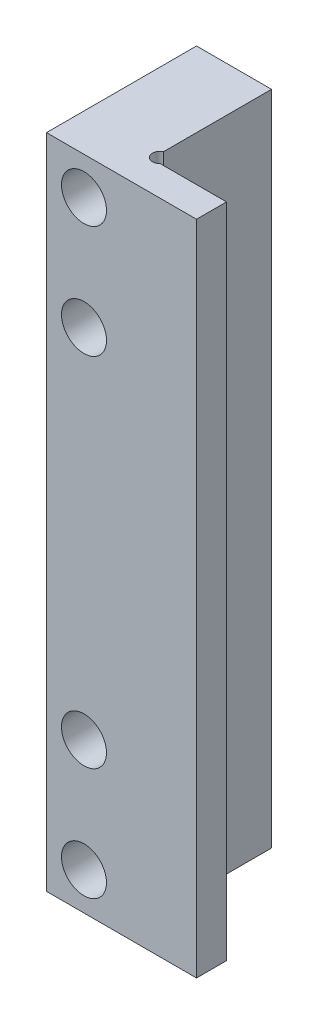
ISO-10303-21;
HEADER;
FILE_DESCRIPTION(('STEP AP214'),'2;1');
FILE_NAME('part.step','',(''),(''),'','','');
FILE_SCHEMA(('AUTOMOTIVE_DESIGN { 1 0 10303 214 1 1 1 1 }'));
ENDSEC;
DATA;
#1=APPLICATION_CONTEXT('core data for automotive mechanical design processes');
#2=APPLICATION_PROTOCOL_DEFINITION('international standard','automotive_design',2000,#1);
#3=PRODUCT_CONTEXT('',#1,'mechanical');
#4=PRODUCT('Part','Part','',(#3));
#5=PRODUCT_RELATED_PRODUCT_CATEGORY('part','',(#4));
#6=PRODUCT_DEFINITION_FORMATION('','',#4);
#7=PRODUCT_DEFINITION_CONTEXT('part definition',#1,'design');
#8=PRODUCT_DEFINITION('design','',#6,#7);
#9=PRODUCT_DEFINITION_SHAPE('','',#8);
#10=(LENGTH_UNIT() NAMED_UNIT(*) SI_UNIT(.MILLI.,.METRE.));
#11=(NAMED_UNIT(*) PLANE_ANGLE_UNIT() SI_UNIT($,.RADIAN.));
#12=(NAMED_UNIT(*) SI_UNIT($,.STERADIAN.) SOLID_ANGLE_UNIT());
#13=UNCERTAINTY_MEASURE_WITH_UNIT(LENGTH_MEASURE(1.E-05),#10,'distance_accuracy_value','');
#14=(GEOMETRIC_REPRESENTATION_CONTEXT(3) GLOBAL_UNCERTAINTY_ASSIGNED_CONTEXT((#13)) GLOBAL_UNIT_ASSIGNED_CONTEXT((#10,
#11,#12)) REPRESENTATION_CONTEXT('',''));
#15=CARTESIAN_POINT('',(0.,0.,0.));
#16=DIRECTION('',(0.,0.,1.));
#17=DIRECTION('',(1.,0.,0.));
#18=AXIS2_PLACEMENT_3D('',#15,#16,#17);
#19=CARTESIAN_POINT('',(-34.9,21.9,-10.));
#20=DIRECTION('',(-1.,0.,0.));
#21=DIRECTION('',(0.,0.,1.));
#22=AXIS2_PLACEMENT_3D('',#19,#20,#21);
#23=PLANE('',#22);
#24=DIRECTION('',(0.,-1.,0.));
#25=VECTOR('',#24,1.);
#26=CARTESIAN_POINT('',(-34.9,21.9,0.));
#27=LINE('',#26,#25);
#28=CARTESIAN_POINT('',(-34.9,21.9,0.));
#29=VERTEX_POINT('',#28);
#30=CARTESIAN_POINT('',(-34.9,-21.9,0.));
#31=VERTEX_POINT('',#30);
#32=EDGE_CURVE('E103',#29,#31,#27,.T.);
#33=ORIENTED_EDGE('',*,*,#32,.F.);
#34=DIRECTION('',(0.,0.,1.));
#35=VECTOR('',#34,1.);
#36=CARTESIAN_POINT('',(-34.9,21.9,-10.));
#37=LINE('',#36,#35);
#38=CARTESIAN_POINT('',(-34.9,21.9,-10.));
#39=VERTEX_POINT('',#38);
#40=EDGE_CURVE('E12',#39,#29,#37,.T.);
#41=ORIENTED_EDGE('',*,*,#40,.F.);
#42=DIRECTION('',(0.,-1.,0.));
#43=VECTOR('',#42,1.);
#44=CARTESIAN_POINT('',(-34.9,21.9,-10.));
#45=LINE('',#44,#43);
#46=CARTESIAN_POINT('',(-34.9,-21.9,-10.));
#47=VERTEX_POINT('',#46);
#48=EDGE_CURVE('E114',#39,#47,#45,.T.);
#49=ORIENTED_EDGE('',*,*,#48,.T.);
#50=DIRECTION('',(0.,0.,1.));
#51=VECTOR('',#50,1.);
#52=CARTESIAN_POINT('',(-34.9,-21.9,-10.));
#53=LINE('',#52,#51);
#54=EDGE_CURVE('E55',#47,#31,#53,.T.);
#55=ORIENTED_EDGE('',*,*,#54,.T.);
#56=EDGE_LOOP('',(#33,#41,#49,#55));
#57=FACE_BOUND('',#56,.T.);
#58=ADVANCED_FACE('F52',(#57),#23,.T.);
#59=CARTESIAN_POINT('',(-34.9,21.9,-10.));
#60=DIRECTION('',(0.,1.,0.));
#61=DIRECTION('',(-1.,0.,0.));
#62=AXIS2_PLACEMENT_3D('',#59,#60,#61);
#63=PLANE('',#62);
#64=DIRECTION('',(-1.,0.,0.));
#65=VECTOR('',#64,1.);
#66=CARTESIAN_POINT('',(0.,21.8999999999999,-2.));
#67=LINE('',#66,#65);
#68=CARTESIAN_POINT('',(-24.8999999999999,21.9,-2.));
#69=VERTEX_POINT('',#68);
#70=CARTESIAN_POINT('',(-29.3226741385377,21.9,-2.));
#71=VERTEX_POINT('',#70);
#72=EDGE_CURVE('E136',#69,#71,#67,.T.);
#73=ORIENTED_EDGE('',*,*,#72,.T.);
#74=CARTESIAN_POINT('',(-29.6839888814211,21.9,-2.34561778972609));
#75=DIRECTION('',(0.,-1.,0.));
#76=DIRECTION('',(1.,0.,0.));
#77=AXIS2_PLACEMENT_3D('',#74,#75,#76);
#78=CIRCLE('',#77,0.499999999999999);
#79=CARTESIAN_POINT('',(-29.8999999999999,21.9,-2.79654926639448));
#80=VERTEX_POINT('',#79);
#81=EDGE_CURVE('E145',#71,#80,#78,.T.);
#82=ORIENTED_EDGE('',*,*,#81,.T.);
#83=DIRECTION('',(0.,0.,-1.));
#84=VECTOR('',#83,1.);
#85=CARTESIAN_POINT('',(-29.8999999999999,21.9,0.));
#86=LINE('',#85,#84);
#87=CARTESIAN_POINT('',(-29.8999999999999,21.9,-10.));
#88=VERTEX_POINT('',#87);
#89=EDGE_CURVE('E141',#80,#88,#86,.T.);
#90=ORIENTED_EDGE('',*,*,#89,.T.);
#91=DIRECTION('',(-1.,0.,0.));
#92=VECTOR('',#91,1.);
#93=CARTESIAN_POINT('',(-34.9,21.9,-10.));
#94=LINE('',#93,#92);
#95=EDGE_CURVE('E76',#88,#39,#94,.T.);
#96=ORIENTED_EDGE('',*,*,#95,.T.);
#97=ORIENTED_EDGE('',*,*,#40,.T.);
#98=DIRECTION('',(-1.,0.,0.));
#99=VECTOR('',#98,1.);
#100=CARTESIAN_POINT('',(-34.9,21.9,0.));
#101=LINE('',#100,#99);
#102=CARTESIAN_POINT('',(-24.9,21.9,0.));
#103=VERTEX_POINT('',#102);
#104=EDGE_CURVE('E98',#103,#29,#101,.T.);
#105=ORIENTED_EDGE('',*,*,#104,.F.);
#106=DIRECTION('',(0.,0.,1.));
#107=VECTOR('',#106,1.);
#108=CARTESIAN_POINT('',(-24.9,21.9,-10.));
#109=LINE('',#108,#107);
#110=EDGE_CURVE('E60',#69,#103,#109,.T.);
#111=ORIENTED_EDGE('',*,*,#110,.F.);
#112=EDGE_LOOP('',(#73,#82,#90,#96,#97,#105,#111));
#113=FACE_BOUND('',#112,.T.);
#114=ADVANCED_FACE('F95',(#113),#63,.T.);
#115=CARTESIAN_POINT('',(-24.9,21.9,-10.));
#116=DIRECTION('',(1.,0.,0.));
#117=DIRECTION('',(0.,1.,0.));
#118=AXIS2_PLACEMENT_3D('',#115,#116,#117);
#119=PLANE('',#118);
#120=DIRECTION('',(0.,-1.,0.));
#121=VECTOR('',#120,1.);
#122=CARTESIAN_POINT('',(-24.8999999999999,21.9,-2.));
#123=LINE('',#122,#121);
#124=CARTESIAN_POINT('',(-24.9,-21.9,-2.));
#125=VERTEX_POINT('',#124);
#126=EDGE_CURVE('E135',#69,#125,#123,.T.);
#127=ORIENTED_EDGE('',*,*,#126,.F.);
#128=ORIENTED_EDGE('',*,*,#110,.T.);
#129=DIRECTION('',(0.,1.,0.));
#130=VECTOR('',#129,1.);
#131=CARTESIAN_POINT('',(-24.9,21.9,0.));
#132=LINE('',#131,#130);
#133=CARTESIAN_POINT('',(-24.9,-21.9,0.));
#134=VERTEX_POINT('',#133);
#135=EDGE_CURVE('E113',#134,#103,#132,.T.);
#136=ORIENTED_EDGE('',*,*,#135,.F.);
#137=DIRECTION('',(0.,0.,1.));
#138=VECTOR('',#137,1.);
#139=CARTESIAN_POINT('',(-24.9,-21.9,-10.));
#140=LINE('',#139,#138);
#141=EDGE_CURVE('E121',#125,#134,#140,.T.);
#142=ORIENTED_EDGE('',*,*,#141,.F.);
#143=EDGE_LOOP('',(#127,#128,#136,#142));
#144=FACE_BOUND('',#143,.T.);
#145=ADVANCED_FACE('F233',(#144),#119,.T.);
#146=CARTESIAN_POINT('',(-24.9,-21.9,-10.));
#147=DIRECTION('',(0.,-1.,0.));
#148=DIRECTION('',(1.,0.,0.));
#149=AXIS2_PLACEMENT_3D('',#146,#147,#148);
#150=PLANE('',#149);
#151=DIRECTION('',(-1.,0.,0.));
#152=VECTOR('',#151,1.);
#153=CARTESIAN_POINT('',(0.,-21.9000000000001,-2.));
#154=LINE('',#153,#152);
#155=CARTESIAN_POINT('',(-29.3226741385379,-21.9,-2.));
#156=VERTEX_POINT('',#155);
#157=EDGE_CURVE('E167',#125,#156,#154,.T.);
#158=ORIENTED_EDGE('',*,*,#157,.F.);
#159=ORIENTED_EDGE('',*,*,#141,.T.);
#160=DIRECTION('',(1.,0.,0.));
#161=VECTOR('',#160,1.);
#162=CARTESIAN_POINT('',(-24.9,-21.9,0.));
#163=LINE('',#162,#161);
#164=EDGE_CURVE('E107',#31,#134,#163,.T.);
#165=ORIENTED_EDGE('',*,*,#164,.F.);
#166=ORIENTED_EDGE('',*,*,#54,.F.);
#167=DIRECTION('',(1.,0.,0.));
#168=VECTOR('',#167,1.);
#169=CARTESIAN_POINT('',(-24.9,-21.9,-10.));
#170=LINE('',#169,#168);
#171=CARTESIAN_POINT('',(-29.9,-21.9,-10.));
#172=VERTEX_POINT('',#171);
#173=EDGE_CURVE('E116',#47,#172,#170,.T.);
#174=ORIENTED_EDGE('',*,*,#173,.T.);
#175=DIRECTION('',(0.,0.,-1.));
#176=VECTOR('',#175,1.);
#177=CARTESIAN_POINT('',(-29.9,-21.9,0.));
#178=LINE('',#177,#176);
#179=CARTESIAN_POINT('',(-29.9,-21.9,-2.79654926639448));
#180=VERTEX_POINT('',#179);
#181=EDGE_CURVE('E68',#180,#172,#178,.T.);
#182=ORIENTED_EDGE('',*,*,#181,.F.);
#183=CARTESIAN_POINT('',(-29.6839888814212,-21.9,-2.34561778972609));
#184=DIRECTION('',(0.,-1.,0.));
#185=DIRECTION('',(1.,0.,0.));
#186=AXIS2_PLACEMENT_3D('',#183,#184,#185);
#187=CIRCLE('',#186,0.499999999999999);
#188=EDGE_CURVE('E148',#156,#180,#187,.T.);
#189=ORIENTED_EDGE('',*,*,#188,.F.);
#190=EDGE_LOOP('',(#158,#159,#165,#166,#174,#182,#189));
#191=FACE_BOUND('',#190,.T.);
#192=ADVANCED_FACE('F128',(#191),#150,.T.);
#193=CARTESIAN_POINT('',(0.,0.,-10.));
#194=DIRECTION('',(0.,0.,-1.));
#195=DIRECTION('',(-1.,0.,0.));
#196=AXIS2_PLACEMENT_3D('',#193,#194,#195);
#197=PLANE('',#196);
#198=CARTESIAN_POINT('',(-32.4,19.4,-10.));
#199=DIRECTION('',(0.,0.,1.));
#200=DIRECTION('',(1.,0.,0.));
#201=AXIS2_PLACEMENT_3D('',#198,#199,#200);
#202=CIRCLE('',#201,1.5);
#203=CARTESIAN_POINT('',(-30.9,19.4,-10.));
#204=VERTEX_POINT('',#203);
#205=EDGE_CURVE('E151',#204,#204,#202,.T.);
#206=ORIENTED_EDGE('',*,*,#205,.T.);
#207=EDGE_LOOP('',(#206));
#208=FACE_BOUND('',#207,.T.);
#209=CARTESIAN_POINT('',(-32.4,-19.4,-10.));
#210=DIRECTION('',(0.,0.,1.));
#211=DIRECTION('',(-1.,0.,0.));
#212=AXIS2_PLACEMENT_3D('',#209,#210,#211);
#213=CIRCLE('',#212,1.5);
#214=CARTESIAN_POINT('',(-33.9,-19.4,-10.));
#215=VERTEX_POINT('',#214);
#216=EDGE_CURVE('E171',#215,#215,#213,.T.);
#217=ORIENTED_EDGE('',*,*,#216,.T.);
#218=EDGE_LOOP('',(#217));
#219=FACE_BOUND('',#218,.T.);
#220=DIRECTION('',(0.,-1.,0.));
#221=VECTOR('',#220,1.);
#222=CARTESIAN_POINT('',(-29.8999999999999,21.9,-10.));
#223=LINE('',#222,#221);
#224=EDGE_CURVE('E132',#88,#172,#223,.T.);
#225=ORIENTED_EDGE('',*,*,#224,.T.);
#226=ORIENTED_EDGE('',*,*,#173,.F.);
#227=ORIENTED_EDGE('',*,*,#48,.F.);
#228=ORIENTED_EDGE('',*,*,#95,.F.);
#229=EDGE_LOOP('',(#225,#226,#227,#228));
#230=FACE_BOUND('',#229,.T.);
#231=ADVANCED_FACE('F131',(#208,#219,#230),#197,.T.);
#232=CARTESIAN_POINT('',(0.,0.,0.));
#233=DIRECTION('',(0.,0.,-1.));
#234=DIRECTION('',(-1.,0.,0.));
#235=AXIS2_PLACEMENT_3D('',#232,#233,#234);
#236=PLANE('',#235);
#237=CARTESIAN_POINT('',(-32.4,11.9,0.));
#238=DIRECTION('',(0.,0.,1.));
#239=DIRECTION('',(1.,0.,0.));
#240=AXIS2_PLACEMENT_3D('',#237,#238,#239);
#241=CIRCLE('',#240,1.5);
#242=CARTESIAN_POINT('',(-30.9,11.9,0.));
#243=VERTEX_POINT('',#242);
#244=EDGE_CURVE('E189',#243,#243,#241,.T.);
#245=ORIENTED_EDGE('',*,*,#244,.F.);
#246=EDGE_LOOP('',(#245));
#247=FACE_BOUND('',#246,.T.);
#248=CARTESIAN_POINT('',(-32.4,-11.9,0.));
#249=DIRECTION('',(0.,0.,1.));
#250=DIRECTION('',(-1.,0.,0.));
#251=AXIS2_PLACEMENT_3D('',#248,#249,#250);
#252=CIRCLE('',#251,1.5);
#253=CARTESIAN_POINT('',(-33.9,-11.9,0.));
#254=VERTEX_POINT('',#253);
#255=EDGE_CURVE('E186',#254,#254,#252,.T.);
#256=ORIENTED_EDGE('',*,*,#255,.F.);
#257=EDGE_LOOP('',(#256));
#258=FACE_BOUND('',#257,.T.);
#259=CARTESIAN_POINT('',(-32.4,19.4,0.));
#260=DIRECTION('',(0.,0.,1.));
#261=DIRECTION('',(1.,0.,0.));
#262=AXIS2_PLACEMENT_3D('',#259,#260,#261);
#263=CIRCLE('',#262,1.5);
#264=CARTESIAN_POINT('',(-30.9,19.4,0.));
#265=VERTEX_POINT('',#264);
#266=EDGE_CURVE('E178',#265,#265,#263,.T.);
#267=ORIENTED_EDGE('',*,*,#266,.F.);
#268=EDGE_LOOP('',(#267));
#269=FACE_BOUND('',#268,.T.);
#270=CARTESIAN_POINT('',(-32.4,-19.4,0.));
#271=DIRECTION('',(0.,0.,1.));
#272=DIRECTION('',(-1.,0.,0.));
#273=AXIS2_PLACEMENT_3D('',#270,#271,#272);
#274=CIRCLE('',#273,1.5);
#275=CARTESIAN_POINT('',(-33.9,-19.4,0.));
#276=VERTEX_POINT('',#275);
#277=EDGE_CURVE('E174',#276,#276,#274,.T.);
#278=ORIENTED_EDGE('',*,*,#277,.F.);
#279=EDGE_LOOP('',(#278));
#280=FACE_BOUND('',#279,.T.);
#281=ORIENTED_EDGE('',*,*,#32,.T.);
#282=ORIENTED_EDGE('',*,*,#164,.T.);
#283=ORIENTED_EDGE('',*,*,#135,.T.);
#284=ORIENTED_EDGE('',*,*,#104,.T.);
#285=EDGE_LOOP('',(#281,#282,#283,#284));
#286=FACE_BOUND('',#285,.T.);
#287=ADVANCED_FACE('F111',(#247,#258,#269,#280,#286),#236,.F.);
#288=CARTESIAN_POINT('',(0.,21.8999999999999,-2.));
#289=DIRECTION('',(0.,0.,1.));
#290=DIRECTION('',(1.,0.,0.));
#291=AXIS2_PLACEMENT_3D('',#288,#289,#290);
#292=PLANE('',#291);
#293=DIRECTION('',(0.,-1.,0.));
#294=VECTOR('',#293,1.);
#295=CARTESIAN_POINT('',(-29.3226741385377,21.9,-2.));
#296=LINE('',#295,#294);
#297=EDGE_CURVE('E139',#156,#71,#296,.F.);
#298=ORIENTED_EDGE('',*,*,#297,.T.);
#299=ORIENTED_EDGE('',*,*,#72,.F.);
#300=ORIENTED_EDGE('',*,*,#126,.T.);
#301=ORIENTED_EDGE('',*,*,#157,.T.);
#302=EDGE_LOOP('',(#298,#299,#300,#301));
#303=FACE_BOUND('',#302,.T.);
#304=ADVANCED_FACE('F206',(#303),#292,.F.);
#305=CARTESIAN_POINT('',(-29.8999999999999,21.9,0.));
#306=DIRECTION('',(-1.,0.,0.));
#307=DIRECTION('',(0.,-1.,0.));
#308=AXIS2_PLACEMENT_3D('',#305,#306,#307);
#309=PLANE('',#308);
#310=DIRECTION('',(0.,-1.,0.));
#311=VECTOR('',#310,1.);
#312=CARTESIAN_POINT('',(-29.8999999999999,21.9,-2.79654926639448));
#313=LINE('',#312,#311);
#314=EDGE_CURVE('E108',#80,#180,#313,.T.);
#315=ORIENTED_EDGE('',*,*,#314,.T.);
#316=ORIENTED_EDGE('',*,*,#181,.T.);
#317=ORIENTED_EDGE('',*,*,#224,.F.);
#318=ORIENTED_EDGE('',*,*,#89,.F.);
#319=EDGE_LOOP('',(#315,#316,#317,#318));
#320=FACE_BOUND('',#319,.T.);
#321=ADVANCED_FACE('F156',(#320),#309,.F.);
#322=CARTESIAN_POINT('',(-29.6839888814211,21.9,-2.34561778972609));
#323=DIRECTION('',(0.,-1.,0.));
#324=DIRECTION('',(1.,0.,0.));
#325=AXIS2_PLACEMENT_3D('',#322,#323,#324);
#326=CYLINDRICAL_SURFACE('',#325,0.499999999999999);
#327=ORIENTED_EDGE('',*,*,#81,.F.);
#328=ORIENTED_EDGE('',*,*,#297,.F.);
#329=ORIENTED_EDGE('',*,*,#188,.T.);
#330=ORIENTED_EDGE('',*,*,#314,.F.);
#331=EDGE_LOOP('',(#327,#328,#329,#330));
#332=FACE_BOUND('',#331,.T.);
#333=ADVANCED_FACE('F165',(#332),#326,.F.);
#334=CARTESIAN_POINT('',(-32.4,-19.4,-10.));
#335=DIRECTION('',(0.,0.,1.));
#336=DIRECTION('',(1.,0.,0.));
#337=AXIS2_PLACEMENT_3D('',#334,#335,#336);
#338=CYLINDRICAL_SURFACE('',#337,1.5);
#339=ORIENTED_EDGE('',*,*,#216,.F.);
#340=EDGE_LOOP('',(#339));
#341=FACE_BOUND('',#340,.T.);
#342=ORIENTED_EDGE('',*,*,#277,.T.);
#343=EDGE_LOOP('',(#342));
#344=FACE_BOUND('',#343,.T.);
#345=ADVANCED_FACE('F214',(#341,#344),#338,.F.);
#346=CARTESIAN_POINT('',(-32.4,19.4,-10.));
#347=DIRECTION('',(0.,0.,1.));
#348=DIRECTION('',(1.,0.,0.));
#349=AXIS2_PLACEMENT_3D('',#346,#347,#348);
#350=CYLINDRICAL_SURFACE('',#349,1.5);
#351=ORIENTED_EDGE('',*,*,#205,.F.);
#352=EDGE_LOOP('',(#351));
#353=FACE_BOUND('',#352,.T.);
#354=ORIENTED_EDGE('',*,*,#266,.T.);
#355=EDGE_LOOP('',(#354));
#356=FACE_BOUND('',#355,.T.);
#357=ADVANCED_FACE('F216',(#353,#356),#350,.F.);
#358=CARTESIAN_POINT('',(-32.4,-11.9,-5.));
#359=DIRECTION('',(0.,0.,1.));
#360=DIRECTION('',(1.,0.,0.));
#361=AXIS2_PLACEMENT_3D('',#358,#359,#360);
#362=CYLINDRICAL_SURFACE('',#361,1.5);
#363=CARTESIAN_POINT('',(-32.4,-11.9,-5.));
#364=DIRECTION('',(0.,0.,1.));
#365=DIRECTION('',(-1.,0.,0.));
#366=AXIS2_PLACEMENT_3D('',#363,#364,#365);
#367=CIRCLE('',#366,1.5);
#368=CARTESIAN_POINT('',(-33.9,-11.9,-5.));
#369=VERTEX_POINT('',#368);
#370=EDGE_CURVE('E183',#369,#369,#367,.T.);
#371=ORIENTED_EDGE('',*,*,#370,.F.);
#372=EDGE_LOOP('',(#371));
#373=FACE_BOUND('',#372,.T.);
#374=ORIENTED_EDGE('',*,*,#255,.T.);
#375=EDGE_LOOP('',(#374));
#376=FACE_BOUND('',#375,.T.);
#377=ADVANCED_FACE('F223',(#373,#376),#362,.F.);
#378=CARTESIAN_POINT('',(-32.4,-11.9,-5.));
#379=DIRECTION('',(0.,0.,-1.));
#380=DIRECTION('',(-1.,0.,0.));
#381=AXIS2_PLACEMENT_3D('',#378,#379,#380);
#382=PLANE('',#381);
#383=ORIENTED_EDGE('',*,*,#370,.T.);
#384=EDGE_LOOP('',(#383));
#385=FACE_BOUND('',#384,.T.);
#386=ADVANCED_FACE('F200',(#385),#382,.F.);
#387=CARTESIAN_POINT('',(-32.4,11.9,-5.));
#388=DIRECTION('',(0.,0.,1.));
#389=DIRECTION('',(1.,0.,0.));
#390=AXIS2_PLACEMENT_3D('',#387,#388,#389);
#391=CYLINDRICAL_SURFACE('',#390,1.5);
#392=CARTESIAN_POINT('',(-32.4,11.9,-5.));
#393=DIRECTION('',(0.,0.,1.));
#394=DIRECTION('',(1.,0.,0.));
#395=AXIS2_PLACEMENT_3D('',#392,#393,#394);
#396=CIRCLE('',#395,1.5);
#397=CARTESIAN_POINT('',(-30.9,11.9,-5.));
#398=VERTEX_POINT('',#397);
#399=EDGE_CURVE('E175',#398,#398,#396,.T.);
#400=ORIENTED_EDGE('',*,*,#399,.F.);
#401=EDGE_LOOP('',(#400));
#402=FACE_BOUND('',#401,.T.);
#403=ORIENTED_EDGE('',*,*,#244,.T.);
#404=EDGE_LOOP('',(#403));
#405=FACE_BOUND('',#404,.T.);
#406=ADVANCED_FACE('F197',(#402,#405),#391,.F.);
#407=CARTESIAN_POINT('',(-32.4,11.9,-5.));
#408=DIRECTION('',(0.,0.,1.));
#409=DIRECTION('',(1.,0.,0.));
#410=AXIS2_PLACEMENT_3D('',#407,#408,#409);
#411=PLANE('',#410);
#412=ORIENTED_EDGE('',*,*,#399,.T.);
#413=EDGE_LOOP('',(#412));
#414=FACE_BOUND('',#413,.T.);
#415=ADVANCED_FACE('F195',(#414),#411,.T.);
#416=CLOSED_SHELL('',(#58,#114,#145,#192,#231,#287,#304,#321,#333,#345,#357,#377,#386,#406,#415));
#417=MANIFOLD_SOLID_BREP('B2',#416);
#418=ADVANCED_BREP_SHAPE_REPRESENTATION('',(#18,#417),#14);
#419=SHAPE_DEFINITION_REPRESENTATION(#9,#418);
ENDSEC;
END-ISO-10303-21;
